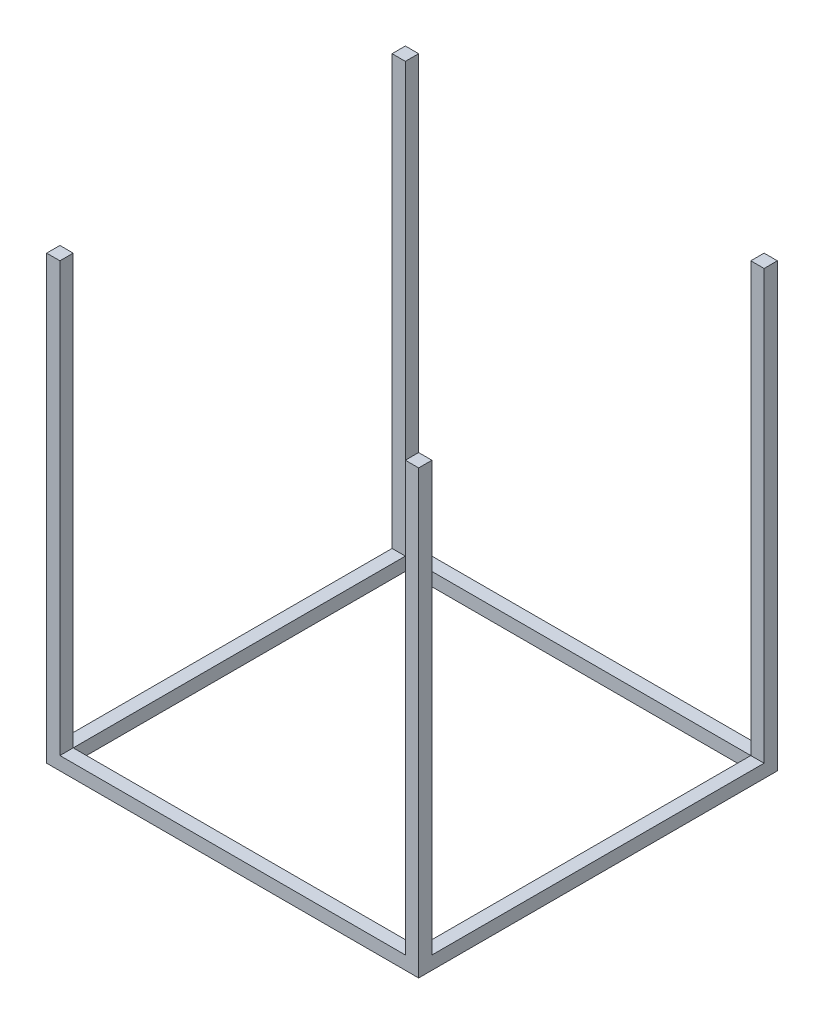
ISO-10303-21;
HEADER;
FILE_DESCRIPTION(('STEP AP214'),'2;1');
FILE_NAME('part.step','',(''),(''),'','','');
FILE_SCHEMA(('AUTOMOTIVE_DESIGN { 1 0 10303 214 1 1 1 1 }'));
ENDSEC;
DATA;
#1=APPLICATION_CONTEXT('core data for automotive mechanical design processes');
#2=APPLICATION_PROTOCOL_DEFINITION('international standard','automotive_design',2000,#1);
#3=PRODUCT_CONTEXT('',#1,'mechanical');
#4=PRODUCT('Part','Part','',(#3));
#5=PRODUCT_RELATED_PRODUCT_CATEGORY('part','',(#4));
#6=PRODUCT_DEFINITION_FORMATION('','',#4);
#7=PRODUCT_DEFINITION_CONTEXT('part definition',#1,'design');
#8=PRODUCT_DEFINITION('design','',#6,#7);
#9=PRODUCT_DEFINITION_SHAPE('','',#8);
#10=(LENGTH_UNIT() NAMED_UNIT(*) SI_UNIT(.MILLI.,.METRE.));
#11=(NAMED_UNIT(*) PLANE_ANGLE_UNIT() SI_UNIT($,.RADIAN.));
#12=(NAMED_UNIT(*) SI_UNIT($,.STERADIAN.) SOLID_ANGLE_UNIT());
#13=UNCERTAINTY_MEASURE_WITH_UNIT(LENGTH_MEASURE(1.E-05),#10,'distance_accuracy_value','');
#14=(GEOMETRIC_REPRESENTATION_CONTEXT(3) GLOBAL_UNCERTAINTY_ASSIGNED_CONTEXT((#13)) GLOBAL_UNIT_ASSIGNED_CONTEXT((#10,
#11,#12)) REPRESENTATION_CONTEXT('',''));
#15=CARTESIAN_POINT('',(0.,0.,0.));
#16=DIRECTION('',(0.,0.,1.));
#17=DIRECTION('',(1.,0.,0.));
#18=AXIS2_PLACEMENT_3D('',#15,#16,#17);
#19=CARTESIAN_POINT('',(0.,50.8,0.));
#20=DIRECTION('',(0.,1.,0.));
#21=DIRECTION('',(0.,0.,1.));
#22=AXIS2_PLACEMENT_3D('',#19,#20,#21);
#23=PLANE('',#22);
#24=DIRECTION('',(1.,0.,0.));
#25=VECTOR('',#24,1.);
#26=CARTESIAN_POINT('',(0.,50.8,685.8));
#27=LINE('',#26,#25);
#28=CARTESIAN_POINT('',(-660.4,50.8,685.8));
#29=VERTEX_POINT('',#28);
#30=CARTESIAN_POINT('',(660.4,50.8,685.8));
#31=VERTEX_POINT('',#30);
#32=EDGE_CURVE('E53',#29,#31,#27,.T.);
#33=ORIENTED_EDGE('',*,*,#32,.T.);
#34=DIRECTION('',(0.,0.,-1.));
#35=VECTOR('',#34,1.);
#36=CARTESIAN_POINT('',(660.400000000003,50.8,2.88657986402542E-12));
#37=LINE('',#36,#35);
#38=CARTESIAN_POINT('',(660.4,50.8,635.));
#39=VERTEX_POINT('',#38);
#40=EDGE_CURVE('E173',#31,#39,#37,.T.);
#41=ORIENTED_EDGE('',*,*,#40,.T.);
#42=DIRECTION('',(1.,0.,0.));
#43=VECTOR('',#42,1.);
#44=CARTESIAN_POINT('',(0.,50.8,635.));
#45=LINE('',#44,#43);
#46=CARTESIAN_POINT('',(-660.4,50.8,635.));
#47=VERTEX_POINT('',#46);
#48=EDGE_CURVE('E285',#47,#39,#45,.T.);
#49=ORIENTED_EDGE('',*,*,#48,.F.);
#50=DIRECTION('',(0.,0.,-1.));
#51=VECTOR('',#50,1.);
#52=CARTESIAN_POINT('',(-660.4,50.8,0.));
#53=LINE('',#52,#51);
#54=EDGE_CURVE('E267',#29,#47,#53,.T.);
#55=ORIENTED_EDGE('',*,*,#54,.F.);
#56=EDGE_LOOP('',(#33,#41,#49,#55));
#57=FACE_BOUND('',#56,.T.);
#58=ADVANCED_FACE('F36',(#57),#23,.T.);
#59=DIRECTION('',(-1.,0.,0.));
#60=VECTOR('',#59,1.);
#61=CARTESIAN_POINT('',(0.,50.8,635.));
#62=LINE('',#61,#60);
#63=CARTESIAN_POINT('',(711.200000000001,50.8,635.));
#64=VERTEX_POINT('',#63);
#65=EDGE_CURVE('E171',#64,#39,#62,.T.);
#66=ORIENTED_EDGE('',*,*,#65,.F.);
#67=DIRECTION('',(0.,0.,-1.));
#68=VECTOR('',#67,1.);
#69=CARTESIAN_POINT('',(711.200000000001,50.8,0.));
#70=LINE('',#69,#68);
#71=CARTESIAN_POINT('',(711.200000000001,50.8,-635.));
#72=VERTEX_POINT('',#71);
#73=EDGE_CURVE('E272',#64,#72,#70,.T.);
#74=ORIENTED_EDGE('',*,*,#73,.T.);
#75=DIRECTION('',(-1.,0.,0.));
#76=VECTOR('',#75,1.);
#77=CARTESIAN_POINT('',(0.,50.8,-635.));
#78=LINE('',#77,#76);
#79=CARTESIAN_POINT('',(660.4,50.8,-635.));
#80=VERTEX_POINT('',#79);
#81=EDGE_CURVE('E217',#72,#80,#78,.T.);
#82=ORIENTED_EDGE('',*,*,#81,.T.);
#83=DIRECTION('',(0.,0.,-1.));
#84=VECTOR('',#83,1.);
#85=CARTESIAN_POINT('',(660.4,50.8,0.));
#86=LINE('',#85,#84);
#87=EDGE_CURVE('E282',#39,#80,#86,.T.);
#88=ORIENTED_EDGE('',*,*,#87,.F.);
#89=EDGE_LOOP('',(#66,#74,#82,#88));
#90=FACE_BOUND('',#89,.T.);
#91=ADVANCED_FACE('F363',(#90),#23,.T.);
#92=DIRECTION('',(0.,0.,1.));
#93=VECTOR('',#92,1.);
#94=CARTESIAN_POINT('',(660.400000000003,50.8,-2.88657986402542E-12));
#95=LINE('',#94,#93);
#96=CARTESIAN_POINT('',(660.4,50.8,-685.8));
#97=VERTEX_POINT('',#96);
#98=EDGE_CURVE('E220',#97,#80,#95,.T.);
#99=ORIENTED_EDGE('',*,*,#98,.F.);
#100=DIRECTION('',(1.,0.,0.));
#101=VECTOR('',#100,1.);
#102=CARTESIAN_POINT('',(0.,50.8,-685.8));
#103=LINE('',#102,#101);
#104=CARTESIAN_POINT('',(-660.4,50.8,-685.8));
#105=VERTEX_POINT('',#104);
#106=EDGE_CURVE('E275',#105,#97,#103,.T.);
#107=ORIENTED_EDGE('',*,*,#106,.F.);
#108=DIRECTION('',(0.,0.,1.));
#109=VECTOR('',#108,1.);
#110=CARTESIAN_POINT('',(-660.4,50.8,0.));
#111=LINE('',#110,#109);
#112=CARTESIAN_POINT('',(-660.4,50.8,-635.));
#113=VERTEX_POINT('',#112);
#114=EDGE_CURVE('E241',#105,#113,#111,.T.);
#115=ORIENTED_EDGE('',*,*,#114,.T.);
#116=DIRECTION('',(1.,0.,0.));
#117=VECTOR('',#116,1.);
#118=CARTESIAN_POINT('',(0.,50.8,-635.));
#119=LINE('',#118,#117);
#120=EDGE_CURVE('E279',#113,#80,#119,.T.);
#121=ORIENTED_EDGE('',*,*,#120,.T.);
#122=EDGE_LOOP('',(#99,#107,#115,#121));
#123=FACE_BOUND('',#122,.T.);
#124=ADVANCED_FACE('F350',(#123),#23,.T.);
#125=CARTESIAN_POINT('',(0.,50.8,-635.));
#126=DIRECTION('',(0.,0.,-1.));
#127=DIRECTION('',(-1.,0.,0.));
#128=AXIS2_PLACEMENT_3D('',#125,#126,#127);
#129=PLANE('',#128);
#130=DIRECTION('',(1.,0.,0.));
#131=VECTOR('',#130,1.);
#132=CARTESIAN_POINT('',(0.,0.,-635.));
#133=LINE('',#132,#131);
#134=CARTESIAN_POINT('',(-660.4,0.,-635.));
#135=VERTEX_POINT('',#134);
#136=CARTESIAN_POINT('',(660.4,0.,-635.));
#137=VERTEX_POINT('',#136);
#138=EDGE_CURVE('E300',#135,#137,#133,.T.);
#139=ORIENTED_EDGE('',*,*,#138,.T.);
#140=DIRECTION('',(0.,-1.,0.));
#141=VECTOR('',#140,1.);
#142=CARTESIAN_POINT('',(660.4,50.8,-635.));
#143=LINE('',#142,#141);
#144=EDGE_CURVE('E11',#80,#137,#143,.T.);
#145=ORIENTED_EDGE('',*,*,#144,.F.);
#146=ORIENTED_EDGE('',*,*,#120,.F.);
#147=DIRECTION('',(0.,-1.,0.));
#148=VECTOR('',#147,1.);
#149=CARTESIAN_POINT('',(-660.4,50.8,-635.));
#150=LINE('',#149,#148);
#151=EDGE_CURVE('E310',#113,#135,#150,.T.);
#152=ORIENTED_EDGE('',*,*,#151,.T.);
#153=EDGE_LOOP('',(#139,#145,#146,#152));
#154=FACE_BOUND('',#153,.T.);
#155=ADVANCED_FACE('F395',(#154),#129,.F.);
#156=CARTESIAN_POINT('',(660.4,50.8,0.));
#157=DIRECTION('',(-1.,0.,0.));
#158=DIRECTION('',(0.,0.,1.));
#159=AXIS2_PLACEMENT_3D('',#156,#157,#158);
#160=PLANE('',#159);
#161=DIRECTION('',(0.,0.,-1.));
#162=VECTOR('',#161,1.);
#163=CARTESIAN_POINT('',(660.4,0.,0.));
#164=LINE('',#163,#162);
#165=CARTESIAN_POINT('',(660.4,0.,635.));
#166=VERTEX_POINT('',#165);
#167=EDGE_CURVE('E303',#166,#137,#164,.T.);
#168=ORIENTED_EDGE('',*,*,#167,.F.);
#169=DIRECTION('',(0.,-1.,0.));
#170=VECTOR('',#169,1.);
#171=CARTESIAN_POINT('',(660.4,50.8,635.));
#172=LINE('',#171,#170);
#173=EDGE_CURVE('E45',#39,#166,#172,.T.);
#174=ORIENTED_EDGE('',*,*,#173,.F.);
#175=ORIENTED_EDGE('',*,*,#87,.T.);
#176=ORIENTED_EDGE('',*,*,#144,.T.);
#177=EDGE_LOOP('',(#168,#174,#175,#176));
#178=FACE_BOUND('',#177,.T.);
#179=ADVANCED_FACE('F399',(#178),#160,.T.);
#180=CARTESIAN_POINT('',(0.,50.8,635.));
#181=DIRECTION('',(0.,0.,-1.));
#182=DIRECTION('',(-1.,0.,0.));
#183=AXIS2_PLACEMENT_3D('',#180,#181,#182);
#184=PLANE('',#183);
#185=DIRECTION('',(1.,0.,0.));
#186=VECTOR('',#185,1.);
#187=CARTESIAN_POINT('',(0.,0.,635.));
#188=LINE('',#187,#186);
#189=CARTESIAN_POINT('',(-660.4,0.,635.));
#190=VERTEX_POINT('',#189);
#191=EDGE_CURVE('E306',#190,#166,#188,.T.);
#192=ORIENTED_EDGE('',*,*,#191,.F.);
#193=DIRECTION('',(0.,-1.,0.));
#194=VECTOR('',#193,1.);
#195=CARTESIAN_POINT('',(-660.4,50.8,635.));
#196=LINE('',#195,#194);
#197=EDGE_CURVE('E313',#47,#190,#196,.T.);
#198=ORIENTED_EDGE('',*,*,#197,.F.);
#199=ORIENTED_EDGE('',*,*,#48,.T.);
#200=ORIENTED_EDGE('',*,*,#173,.T.);
#201=EDGE_LOOP('',(#192,#198,#199,#200));
#202=FACE_BOUND('',#201,.T.);
#203=ADVANCED_FACE('F405',(#202),#184,.T.);
#204=CARTESIAN_POINT('',(0.,50.8,685.8));
#205=DIRECTION('',(0.,0.,-1.));
#206=DIRECTION('',(-1.,0.,0.));
#207=AXIS2_PLACEMENT_3D('',#204,#205,#206);
#208=PLANE('',#207);
#209=DIRECTION('',(0.,-1.,0.));
#210=VECTOR('',#209,1.);
#211=CARTESIAN_POINT('',(711.200000000001,50.8,685.8));
#212=LINE('',#211,#210);
#213=CARTESIAN_POINT('',(711.200000000001,1689.1,685.8));
#214=VERTEX_POINT('',#213);
#215=CARTESIAN_POINT('',(711.200000000001,0.,685.8));
#216=VERTEX_POINT('',#215);
#217=EDGE_CURVE('E40',#214,#216,#212,.T.);
#218=ORIENTED_EDGE('',*,*,#217,.F.);
#219=DIRECTION('',(1.,0.,0.));
#220=VECTOR('',#219,1.);
#221=CARTESIAN_POINT('',(0.,1689.1,685.8));
#222=LINE('',#221,#220);
#223=CARTESIAN_POINT('',(660.4,1689.1,685.8));
#224=VERTEX_POINT('',#223);
#225=EDGE_CURVE('E183',#224,#214,#222,.T.);
#226=ORIENTED_EDGE('',*,*,#225,.F.);
#227=DIRECTION('',(0.,-1.,0.));
#228=VECTOR('',#227,1.);
#229=CARTESIAN_POINT('',(660.4,1689.1,685.8));
#230=LINE('',#229,#228);
#231=EDGE_CURVE('E174',#224,#31,#230,.T.);
#232=ORIENTED_EDGE('',*,*,#231,.T.);
#233=ORIENTED_EDGE('',*,*,#32,.F.);
#234=DIRECTION('',(0.,-1.,0.));
#235=VECTOR('',#234,1.);
#236=CARTESIAN_POINT('',(-660.4,1689.1,685.8));
#237=LINE('',#236,#235);
#238=CARTESIAN_POINT('',(-660.4,1689.1,685.8));
#239=VERTEX_POINT('',#238);
#240=EDGE_CURVE('E256',#239,#29,#237,.T.);
#241=ORIENTED_EDGE('',*,*,#240,.F.);
#242=DIRECTION('',(1.,0.,0.));
#243=VECTOR('',#242,1.);
#244=CARTESIAN_POINT('',(0.,1689.1,685.8));
#245=LINE('',#244,#243);
#246=CARTESIAN_POINT('',(-711.2,1689.1,685.8));
#247=VERTEX_POINT('',#246);
#248=EDGE_CURVE('E254',#247,#239,#245,.T.);
#249=ORIENTED_EDGE('',*,*,#248,.F.);
#250=DIRECTION('',(0.,-1.,0.));
#251=VECTOR('',#250,1.);
#252=CARTESIAN_POINT('',(-711.2,50.8,685.8));
#253=LINE('',#252,#251);
#254=CARTESIAN_POINT('',(-711.2,0.,685.8));
#255=VERTEX_POINT('',#254);
#256=EDGE_CURVE('E291',#247,#255,#253,.T.);
#257=ORIENTED_EDGE('',*,*,#256,.T.);
#258=DIRECTION('',(1.,0.,0.));
#259=VECTOR('',#258,1.);
#260=CARTESIAN_POINT('',(0.,0.,685.8));
#261=LINE('',#260,#259);
#262=EDGE_CURVE('E270',#255,#216,#261,.T.);
#263=ORIENTED_EDGE('',*,*,#262,.T.);
#264=EDGE_LOOP('',(#218,#226,#232,#233,#241,#249,#257,#263));
#265=FACE_BOUND('',#264,.T.);
#266=ADVANCED_FACE('F38',(#265),#208,.F.);
#267=CARTESIAN_POINT('',(711.200000000001,50.8,0.));
#268=DIRECTION('',(-1.,0.,0.));
#269=DIRECTION('',(0.,0.,1.));
#270=AXIS2_PLACEMENT_3D('',#267,#268,#269);
#271=PLANE('',#270);
#272=ORIENTED_EDGE('',*,*,#73,.F.);
#273=DIRECTION('',(0.,-1.,0.));
#274=VECTOR('',#273,1.);
#275=CARTESIAN_POINT('',(711.200000000001,1689.1,635.));
#276=LINE('',#275,#274);
#277=CARTESIAN_POINT('',(711.200000000001,1689.1,635.));
#278=VERTEX_POINT('',#277);
#279=EDGE_CURVE('E193',#278,#64,#276,.T.);
#280=ORIENTED_EDGE('',*,*,#279,.F.);
#281=DIRECTION('',(0.,0.,-1.));
#282=VECTOR('',#281,1.);
#283=CARTESIAN_POINT('',(711.200000000001,1689.1,0.));
#284=LINE('',#283,#282);
#285=EDGE_CURVE('E187',#214,#278,#284,.T.);
#286=ORIENTED_EDGE('',*,*,#285,.F.);
#287=ORIENTED_EDGE('',*,*,#217,.T.);
#288=DIRECTION('',(0.,0.,-1.));
#289=VECTOR('',#288,1.);
#290=CARTESIAN_POINT('',(711.200000000001,0.,0.));
#291=LINE('',#290,#289);
#292=CARTESIAN_POINT('',(711.200000000001,0.,-685.8));
#293=VERTEX_POINT('',#292);
#294=EDGE_CURVE('E293',#216,#293,#291,.T.);
#295=ORIENTED_EDGE('',*,*,#294,.T.);
#296=DIRECTION('',(0.,-1.,0.));
#297=VECTOR('',#296,1.);
#298=CARTESIAN_POINT('',(711.200000000001,50.8,-685.8));
#299=LINE('',#298,#297);
#300=CARTESIAN_POINT('',(711.200000000001,1689.1,-685.8));
#301=VERTEX_POINT('',#300);
#302=EDGE_CURVE('E319',#301,#293,#299,.T.);
#303=ORIENTED_EDGE('',*,*,#302,.F.);
#304=DIRECTION('',(0.,0.,-1.));
#305=VECTOR('',#304,1.);
#306=CARTESIAN_POINT('',(711.200000000001,1689.1,0.));
#307=LINE('',#306,#305);
#308=CARTESIAN_POINT('',(711.200000000001,1689.1,-635.));
#309=VERTEX_POINT('',#308);
#310=EDGE_CURVE('E203',#309,#301,#307,.T.);
#311=ORIENTED_EDGE('',*,*,#310,.F.);
#312=DIRECTION('',(0.,-1.,0.));
#313=VECTOR('',#312,1.);
#314=CARTESIAN_POINT('',(711.200000000001,1689.1,-635.));
#315=LINE('',#314,#313);
#316=EDGE_CURVE('E211',#309,#72,#315,.T.);
#317=ORIENTED_EDGE('',*,*,#316,.T.);
#318=EDGE_LOOP('',(#272,#280,#286,#287,#295,#303,#311,#317));
#319=FACE_BOUND('',#318,.T.);
#320=ADVANCED_FACE('F325',(#319),#271,.F.);
#321=CARTESIAN_POINT('',(0.,50.8,-685.8));
#322=DIRECTION('',(0.,0.,-1.));
#323=DIRECTION('',(-1.,0.,0.));
#324=AXIS2_PLACEMENT_3D('',#321,#322,#323);
#325=PLANE('',#324);
#326=ORIENTED_EDGE('',*,*,#106,.T.);
#327=DIRECTION('',(0.,-1.,0.));
#328=VECTOR('',#327,1.);
#329=CARTESIAN_POINT('',(660.4,1689.1,-685.8));
#330=LINE('',#329,#328);
#331=CARTESIAN_POINT('',(660.4,1689.1,-685.8));
#332=VERTEX_POINT('',#331);
#333=EDGE_CURVE('E209',#332,#97,#330,.T.);
#334=ORIENTED_EDGE('',*,*,#333,.F.);
#335=DIRECTION('',(1.,0.,0.));
#336=VECTOR('',#335,1.);
#337=CARTESIAN_POINT('',(0.,1689.1,-685.8));
#338=LINE('',#337,#336);
#339=EDGE_CURVE('E206',#332,#301,#338,.T.);
#340=ORIENTED_EDGE('',*,*,#339,.T.);
#341=ORIENTED_EDGE('',*,*,#302,.T.);
#342=DIRECTION('',(1.,0.,0.));
#343=VECTOR('',#342,1.);
#344=CARTESIAN_POINT('',(0.,0.,-685.8));
#345=LINE('',#344,#343);
#346=CARTESIAN_POINT('',(-711.2,0.,-685.8));
#347=VERTEX_POINT('',#346);
#348=EDGE_CURVE('E295',#347,#293,#345,.T.);
#349=ORIENTED_EDGE('',*,*,#348,.F.);
#350=DIRECTION('',(0.,-1.,0.));
#351=VECTOR('',#350,1.);
#352=CARTESIAN_POINT('',(-711.2,50.8,-685.8));
#353=LINE('',#352,#351);
#354=CARTESIAN_POINT('',(-711.2,1689.1,-685.8));
#355=VERTEX_POINT('',#354);
#356=EDGE_CURVE('E317',#355,#347,#353,.T.);
#357=ORIENTED_EDGE('',*,*,#356,.F.);
#358=DIRECTION('',(1.,0.,0.));
#359=VECTOR('',#358,1.);
#360=CARTESIAN_POINT('',(0.,1689.1,-685.8));
#361=LINE('',#360,#359);
#362=CARTESIAN_POINT('',(-660.4,1689.1,-685.8));
#363=VERTEX_POINT('',#362);
#364=EDGE_CURVE('E227',#355,#363,#361,.T.);
#365=ORIENTED_EDGE('',*,*,#364,.T.);
#366=DIRECTION('',(0.,-1.,0.));
#367=VECTOR('',#366,1.);
#368=CARTESIAN_POINT('',(-660.4,1689.1,-685.8));
#369=LINE('',#368,#367);
#370=EDGE_CURVE('E235',#363,#105,#369,.T.);
#371=ORIENTED_EDGE('',*,*,#370,.T.);
#372=EDGE_LOOP('',(#326,#334,#340,#341,#349,#357,#365,#371));
#373=FACE_BOUND('',#372,.T.);
#374=ADVANCED_FACE('F333',(#373),#325,.T.);
#375=CARTESIAN_POINT('',(-711.2,50.8,0.));
#376=DIRECTION('',(-1.,0.,0.));
#377=DIRECTION('',(0.,0.,1.));
#378=AXIS2_PLACEMENT_3D('',#375,#376,#377);
#379=PLANE('',#378);
#380=DIRECTION('',(0.,0.,-1.));
#381=VECTOR('',#380,1.);
#382=CARTESIAN_POINT('',(-711.2,50.8,0.));
#383=LINE('',#382,#381);
#384=CARTESIAN_POINT('',(-711.2,50.8,635.));
#385=VERTEX_POINT('',#384);
#386=CARTESIAN_POINT('',(-711.2,50.8,-635.));
#387=VERTEX_POINT('',#386);
#388=EDGE_CURVE('E61',#385,#387,#383,.T.);
#389=ORIENTED_EDGE('',*,*,#388,.T.);
#390=DIRECTION('',(0.,-1.,0.));
#391=VECTOR('',#390,1.);
#392=CARTESIAN_POINT('',(-711.2,1689.1,-635.));
#393=LINE('',#392,#391);
#394=CARTESIAN_POINT('',(-711.2,1689.1,-635.));
#395=VERTEX_POINT('',#394);
#396=EDGE_CURVE('E233',#395,#387,#393,.T.);
#397=ORIENTED_EDGE('',*,*,#396,.F.);
#398=DIRECTION('',(0.,0.,-1.));
#399=VECTOR('',#398,1.);
#400=CARTESIAN_POINT('',(-711.2,1689.1,0.));
#401=LINE('',#400,#399);
#402=EDGE_CURVE('E230',#395,#355,#401,.T.);
#403=ORIENTED_EDGE('',*,*,#402,.T.);
#404=ORIENTED_EDGE('',*,*,#356,.T.);
#405=DIRECTION('',(0.,0.,-1.));
#406=VECTOR('',#405,1.);
#407=CARTESIAN_POINT('',(-711.2,0.,0.));
#408=LINE('',#407,#406);
#409=EDGE_CURVE('E298',#255,#347,#408,.T.);
#410=ORIENTED_EDGE('',*,*,#409,.F.);
#411=ORIENTED_EDGE('',*,*,#256,.F.);
#412=DIRECTION('',(0.,0.,-1.));
#413=VECTOR('',#412,1.);
#414=CARTESIAN_POINT('',(-711.2,1689.1,0.));
#415=LINE('',#414,#413);
#416=CARTESIAN_POINT('',(-711.2,1689.1,635.));
#417=VERTEX_POINT('',#416);
#418=EDGE_CURVE('E251',#247,#417,#415,.T.);
#419=ORIENTED_EDGE('',*,*,#418,.T.);
#420=DIRECTION('',(0.,-1.,0.));
#421=VECTOR('',#420,1.);
#422=CARTESIAN_POINT('',(-711.2,1689.1,635.));
#423=LINE('',#422,#421);
#424=EDGE_CURVE('E259',#417,#385,#423,.T.);
#425=ORIENTED_EDGE('',*,*,#424,.T.);
#426=EDGE_LOOP('',(#389,#397,#403,#404,#410,#411,#419,#425));
#427=FACE_BOUND('',#426,.T.);
#428=ADVANCED_FACE('F342',(#427),#379,.T.);
#429=CARTESIAN_POINT('',(-660.4,50.8,0.));
#430=DIRECTION('',(-1.,0.,0.));
#431=DIRECTION('',(0.,0.,1.));
#432=AXIS2_PLACEMENT_3D('',#429,#430,#431);
#433=PLANE('',#432);
#434=DIRECTION('',(0.,0.,-1.));
#435=VECTOR('',#434,1.);
#436=CARTESIAN_POINT('',(-660.4,0.,0.));
#437=LINE('',#436,#435);
#438=EDGE_CURVE('E273',#190,#135,#437,.T.);
#439=ORIENTED_EDGE('',*,*,#438,.T.);
#440=ORIENTED_EDGE('',*,*,#151,.F.);
#441=DIRECTION('',(0.,0.,-1.));
#442=VECTOR('',#441,1.);
#443=CARTESIAN_POINT('',(-660.4,50.8,0.));
#444=LINE('',#443,#442);
#445=EDGE_CURVE('E288',#47,#113,#444,.T.);
#446=ORIENTED_EDGE('',*,*,#445,.F.);
#447=ORIENTED_EDGE('',*,*,#197,.T.);
#448=EDGE_LOOP('',(#439,#440,#446,#447));
#449=FACE_BOUND('',#448,.T.);
#450=ADVANCED_FACE('F385',(#449),#433,.F.);
#451=DIRECTION('',(1.,0.,0.));
#452=VECTOR('',#451,1.);
#453=CARTESIAN_POINT('',(0.,50.8,-635.));
#454=LINE('',#453,#452);
#455=EDGE_CURVE('E244',#387,#113,#454,.T.);
#456=ORIENTED_EDGE('',*,*,#455,.F.);
#457=ORIENTED_EDGE('',*,*,#388,.F.);
#458=DIRECTION('',(1.,0.,0.));
#459=VECTOR('',#458,1.);
#460=CARTESIAN_POINT('',(0.,50.8,635.));
#461=LINE('',#460,#459);
#462=EDGE_CURVE('E265',#385,#47,#461,.T.);
#463=ORIENTED_EDGE('',*,*,#462,.T.);
#464=ORIENTED_EDGE('',*,*,#445,.T.);
#465=EDGE_LOOP('',(#456,#457,#463,#464));
#466=FACE_BOUND('',#465,.T.);
#467=ADVANCED_FACE('F378',(#466),#23,.T.);
#468=CARTESIAN_POINT('',(0.,0.,0.));
#469=DIRECTION('',(0.,1.,0.));
#470=DIRECTION('',(0.,0.,1.));
#471=AXIS2_PLACEMENT_3D('',#468,#469,#470);
#472=PLANE('',#471);
#473=ORIENTED_EDGE('',*,*,#191,.T.);
#474=ORIENTED_EDGE('',*,*,#167,.T.);
#475=ORIENTED_EDGE('',*,*,#138,.F.);
#476=ORIENTED_EDGE('',*,*,#438,.F.);
#477=EDGE_LOOP('',(#473,#474,#475,#476));
#478=FACE_BOUND('',#477,.T.);
#479=ORIENTED_EDGE('',*,*,#348,.T.);
#480=ORIENTED_EDGE('',*,*,#294,.F.);
#481=ORIENTED_EDGE('',*,*,#262,.F.);
#482=ORIENTED_EDGE('',*,*,#409,.T.);
#483=EDGE_LOOP('',(#479,#480,#481,#482));
#484=FACE_BOUND('',#483,.T.);
#485=ADVANCED_FACE('F332',(#478,#484),#472,.F.);
#486=CARTESIAN_POINT('',(-660.4,1689.1,0.));
#487=DIRECTION('',(1.,0.,0.));
#488=DIRECTION('',(0.,0.,-1.));
#489=AXIS2_PLACEMENT_3D('',#486,#487,#488);
#490=PLANE('',#489);
#491=ORIENTED_EDGE('',*,*,#240,.T.);
#492=ORIENTED_EDGE('',*,*,#54,.T.);
#493=DIRECTION('',(0.,-1.,0.));
#494=VECTOR('',#493,1.);
#495=CARTESIAN_POINT('',(-660.4,1689.1,635.));
#496=LINE('',#495,#494);
#497=CARTESIAN_POINT('',(-660.4,1689.1,635.));
#498=VERTEX_POINT('',#497);
#499=EDGE_CURVE('E262',#498,#47,#496,.T.);
#500=ORIENTED_EDGE('',*,*,#499,.F.);
#501=DIRECTION('',(0.,0.,1.));
#502=VECTOR('',#501,1.);
#503=CARTESIAN_POINT('',(-660.4,1689.1,0.));
#504=LINE('',#503,#502);
#505=EDGE_CURVE('E246',#498,#239,#504,.T.);
#506=ORIENTED_EDGE('',*,*,#505,.T.);
#507=EDGE_LOOP('',(#491,#492,#500,#506));
#508=FACE_BOUND('',#507,.T.);
#509=ADVANCED_FACE('F390',(#508),#490,.T.);
#510=CARTESIAN_POINT('',(0.,1689.1,635.));
#511=DIRECTION('',(0.,0.,1.));
#512=DIRECTION('',(1.,0.,0.));
#513=AXIS2_PLACEMENT_3D('',#510,#511,#512);
#514=PLANE('',#513);
#515=ORIENTED_EDGE('',*,*,#462,.F.);
#516=ORIENTED_EDGE('',*,*,#424,.F.);
#517=DIRECTION('',(-1.,0.,0.));
#518=VECTOR('',#517,1.);
#519=CARTESIAN_POINT('',(0.,1689.1,635.));
#520=LINE('',#519,#518);
#521=EDGE_CURVE('E249',#498,#417,#520,.T.);
#522=ORIENTED_EDGE('',*,*,#521,.F.);
#523=ORIENTED_EDGE('',*,*,#499,.T.);
#524=EDGE_LOOP('',(#515,#516,#522,#523));
#525=FACE_BOUND('',#524,.T.);
#526=ADVANCED_FACE('F436',(#525),#514,.F.);
#527=CARTESIAN_POINT('',(0.,1689.1,0.));
#528=DIRECTION('',(0.,1.,0.));
#529=DIRECTION('',(0.,0.,1.));
#530=AXIS2_PLACEMENT_3D('',#527,#528,#529);
#531=PLANE('',#530);
#532=ORIENTED_EDGE('',*,*,#505,.F.);
#533=ORIENTED_EDGE('',*,*,#521,.T.);
#534=ORIENTED_EDGE('',*,*,#418,.F.);
#535=ORIENTED_EDGE('',*,*,#248,.T.);
#536=EDGE_LOOP('',(#532,#533,#534,#535));
#537=FACE_BOUND('',#536,.T.);
#538=ADVANCED_FACE('F441',(#537),#531,.T.);
#539=CARTESIAN_POINT('',(0.,1689.1,-635.));
#540=DIRECTION('',(0.,0.,1.));
#541=DIRECTION('',(1.,0.,0.));
#542=AXIS2_PLACEMENT_3D('',#539,#540,#541);
#543=PLANE('',#542);
#544=ORIENTED_EDGE('',*,*,#396,.T.);
#545=ORIENTED_EDGE('',*,*,#455,.T.);
#546=DIRECTION('',(0.,-1.,0.));
#547=VECTOR('',#546,1.);
#548=CARTESIAN_POINT('',(-660.4,1689.1,-635.));
#549=LINE('',#548,#547);
#550=CARTESIAN_POINT('',(-660.4,1689.1,-635.));
#551=VERTEX_POINT('',#550);
#552=EDGE_CURVE('E238',#551,#113,#549,.T.);
#553=ORIENTED_EDGE('',*,*,#552,.F.);
#554=DIRECTION('',(-1.,0.,0.));
#555=VECTOR('',#554,1.);
#556=CARTESIAN_POINT('',(0.,1689.1,-635.));
#557=LINE('',#556,#555);
#558=EDGE_CURVE('E222',#551,#395,#557,.T.);
#559=ORIENTED_EDGE('',*,*,#558,.T.);
#560=EDGE_LOOP('',(#544,#545,#553,#559));
#561=FACE_BOUND('',#560,.T.);
#562=ADVANCED_FACE('F344',(#561),#543,.T.);
#563=CARTESIAN_POINT('',(-660.4,1689.1,0.));
#564=DIRECTION('',(-1.,0.,0.));
#565=DIRECTION('',(0.,0.,1.));
#566=AXIS2_PLACEMENT_3D('',#563,#564,#565);
#567=PLANE('',#566);
#568=ORIENTED_EDGE('',*,*,#114,.F.);
#569=ORIENTED_EDGE('',*,*,#370,.F.);
#570=DIRECTION('',(0.,0.,-1.));
#571=VECTOR('',#570,1.);
#572=CARTESIAN_POINT('',(-660.4,1689.1,0.));
#573=LINE('',#572,#571);
#574=EDGE_CURVE('E225',#551,#363,#573,.T.);
#575=ORIENTED_EDGE('',*,*,#574,.F.);
#576=ORIENTED_EDGE('',*,*,#552,.T.);
#577=EDGE_LOOP('',(#568,#569,#575,#576));
#578=FACE_BOUND('',#577,.T.);
#579=ADVANCED_FACE('F346',(#578),#567,.F.);
#580=CARTESIAN_POINT('',(0.,1689.1,0.));
#581=DIRECTION('',(0.,1.,0.));
#582=DIRECTION('',(0.,0.,1.));
#583=AXIS2_PLACEMENT_3D('',#580,#581,#582);
#584=PLANE('',#583);
#585=ORIENTED_EDGE('',*,*,#558,.F.);
#586=ORIENTED_EDGE('',*,*,#574,.T.);
#587=ORIENTED_EDGE('',*,*,#364,.F.);
#588=ORIENTED_EDGE('',*,*,#402,.F.);
#589=EDGE_LOOP('',(#585,#586,#587,#588));
#590=FACE_BOUND('',#589,.T.);
#591=ADVANCED_FACE('F339',(#590),#584,.T.);
#592=CARTESIAN_POINT('',(660.400000000003,1689.1,-2.88657986402542E-12));
#593=DIRECTION('',(-1.,0.,0.));
#594=DIRECTION('',(0.,0.,1.));
#595=AXIS2_PLACEMENT_3D('',#592,#593,#594);
#596=PLANE('',#595);
#597=ORIENTED_EDGE('',*,*,#333,.T.);
#598=ORIENTED_EDGE('',*,*,#98,.T.);
#599=DIRECTION('',(0.,-1.,0.));
#600=VECTOR('',#599,1.);
#601=CARTESIAN_POINT('',(660.4,1689.1,-635.));
#602=LINE('',#601,#600);
#603=CARTESIAN_POINT('',(660.4,1689.1,-635.));
#604=VERTEX_POINT('',#603);
#605=EDGE_CURVE('E214',#604,#80,#602,.T.);
#606=ORIENTED_EDGE('',*,*,#605,.F.);
#607=DIRECTION('',(0.,0.,-1.));
#608=VECTOR('',#607,1.);
#609=CARTESIAN_POINT('',(660.400000000003,1689.1,-2.88657986402542E-12));
#610=LINE('',#609,#608);
#611=EDGE_CURVE('E198',#604,#332,#610,.T.);
#612=ORIENTED_EDGE('',*,*,#611,.T.);
#613=EDGE_LOOP('',(#597,#598,#606,#612));
#614=FACE_BOUND('',#613,.T.);
#615=ADVANCED_FACE('F354',(#614),#596,.T.);
#616=CARTESIAN_POINT('',(0.,1689.1,-635.));
#617=DIRECTION('',(0.,0.,-1.));
#618=DIRECTION('',(-1.,0.,0.));
#619=AXIS2_PLACEMENT_3D('',#616,#617,#618);
#620=PLANE('',#619);
#621=ORIENTED_EDGE('',*,*,#81,.F.);
#622=ORIENTED_EDGE('',*,*,#316,.F.);
#623=DIRECTION('',(1.,0.,0.));
#624=VECTOR('',#623,1.);
#625=CARTESIAN_POINT('',(0.,1689.1,-635.));
#626=LINE('',#625,#624);
#627=EDGE_CURVE('E201',#604,#309,#626,.T.);
#628=ORIENTED_EDGE('',*,*,#627,.F.);
#629=ORIENTED_EDGE('',*,*,#605,.T.);
#630=EDGE_LOOP('',(#621,#622,#628,#629));
#631=FACE_BOUND('',#630,.T.);
#632=ADVANCED_FACE('F358',(#631),#620,.F.);
#633=CARTESIAN_POINT('',(0.,1689.1,0.));
#634=DIRECTION('',(0.,1.,0.));
#635=DIRECTION('',(0.,0.,1.));
#636=AXIS2_PLACEMENT_3D('',#633,#634,#635);
#637=PLANE('',#636);
#638=ORIENTED_EDGE('',*,*,#611,.F.);
#639=ORIENTED_EDGE('',*,*,#627,.T.);
#640=ORIENTED_EDGE('',*,*,#310,.T.);
#641=ORIENTED_EDGE('',*,*,#339,.F.);
#642=EDGE_LOOP('',(#638,#639,#640,#641));
#643=FACE_BOUND('',#642,.T.);
#644=ADVANCED_FACE('F367',(#643),#637,.T.);
#645=CARTESIAN_POINT('',(0.,1689.1,635.));
#646=DIRECTION('',(0.,0.,-1.));
#647=DIRECTION('',(-1.,0.,0.));
#648=AXIS2_PLACEMENT_3D('',#645,#646,#647);
#649=PLANE('',#648);
#650=ORIENTED_EDGE('',*,*,#279,.T.);
#651=ORIENTED_EDGE('',*,*,#65,.T.);
#652=DIRECTION('',(0.,-1.,0.));
#653=VECTOR('',#652,1.);
#654=CARTESIAN_POINT('',(660.4,1689.1,635.));
#655=LINE('',#654,#653);
#656=CARTESIAN_POINT('',(660.4,1689.1,635.));
#657=VERTEX_POINT('',#656);
#658=EDGE_CURVE('E164',#657,#39,#655,.T.);
#659=ORIENTED_EDGE('',*,*,#658,.F.);
#660=DIRECTION('',(1.,0.,0.));
#661=VECTOR('',#660,1.);
#662=CARTESIAN_POINT('',(0.,1689.1,635.));
#663=LINE('',#662,#661);
#664=EDGE_CURVE('E169',#657,#278,#663,.T.);
#665=ORIENTED_EDGE('',*,*,#664,.T.);
#666=EDGE_LOOP('',(#650,#651,#659,#665));
#667=FACE_BOUND('',#666,.T.);
#668=ADVANCED_FACE('F167',(#667),#649,.T.);
#669=CARTESIAN_POINT('',(660.400000000003,1689.1,2.88657986402542E-12));
#670=DIRECTION('',(1.,0.,0.));
#671=DIRECTION('',(0.,0.,-1.));
#672=AXIS2_PLACEMENT_3D('',#669,#670,#671);
#673=PLANE('',#672);
#674=ORIENTED_EDGE('',*,*,#40,.F.);
#675=ORIENTED_EDGE('',*,*,#231,.F.);
#676=DIRECTION('',(0.,0.,1.));
#677=VECTOR('',#676,1.);
#678=CARTESIAN_POINT('',(660.400000000003,1689.1,2.88657986402542E-12));
#679=LINE('',#678,#677);
#680=EDGE_CURVE('E177',#657,#224,#679,.T.);
#681=ORIENTED_EDGE('',*,*,#680,.F.);
#682=ORIENTED_EDGE('',*,*,#658,.T.);
#683=EDGE_LOOP('',(#674,#675,#681,#682));
#684=FACE_BOUND('',#683,.T.);
#685=ADVANCED_FACE('F178',(#684),#673,.F.);
#686=CARTESIAN_POINT('',(0.,1689.1,0.));
#687=DIRECTION('',(0.,1.,0.));
#688=DIRECTION('',(0.,0.,1.));
#689=AXIS2_PLACEMENT_3D('',#686,#687,#688);
#690=PLANE('',#689);
#691=ORIENTED_EDGE('',*,*,#664,.F.);
#692=ORIENTED_EDGE('',*,*,#680,.T.);
#693=ORIENTED_EDGE('',*,*,#225,.T.);
#694=ORIENTED_EDGE('',*,*,#285,.T.);
#695=EDGE_LOOP('',(#691,#692,#693,#694));
#696=FACE_BOUND('',#695,.T.);
#697=ADVANCED_FACE('F185',(#696),#690,.T.);
#698=CLOSED_SHELL('',(#58,#91,#124,#155,#179,#203,#266,#320,#374,#428,#450,#467,#485,#509,#526,
#538,#562,#579,#591,#615,#632,#644,#668,#685,#697));
#699=MANIFOLD_SOLID_BREP('B2',#698);
#700=ADVANCED_BREP_SHAPE_REPRESENTATION('',(#18,#699),#14);
#701=SHAPE_DEFINITION_REPRESENTATION(#9,#700);
ENDSEC;
END-ISO-10303-21;
